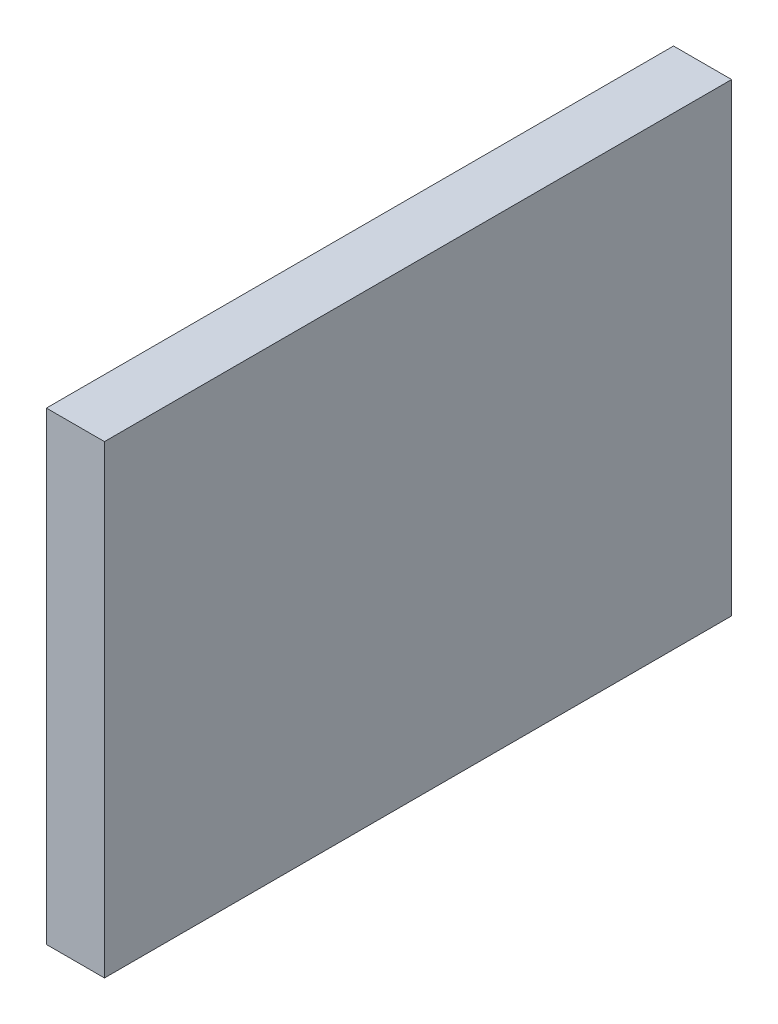
ISO-10303-21;
HEADER;
FILE_DESCRIPTION(('STEP AP214'),'2;1');
FILE_NAME('part.step','',(''),(''),'','','');
FILE_SCHEMA(('AUTOMOTIVE_DESIGN { 1 0 10303 214 1 1 1 1 }'));
ENDSEC;
DATA;
#1=APPLICATION_CONTEXT('core data for automotive mechanical design processes');
#2=APPLICATION_PROTOCOL_DEFINITION('international standard','automotive_design',2000,#1);
#3=PRODUCT_CONTEXT('',#1,'mechanical');
#4=PRODUCT('Part','Part','',(#3));
#5=PRODUCT_RELATED_PRODUCT_CATEGORY('part','',(#4));
#6=PRODUCT_DEFINITION_FORMATION('','',#4);
#7=PRODUCT_DEFINITION_CONTEXT('part definition',#1,'design');
#8=PRODUCT_DEFINITION('design','',#6,#7);
#9=PRODUCT_DEFINITION_SHAPE('','',#8);
#10=(LENGTH_UNIT() NAMED_UNIT(*) SI_UNIT(.MILLI.,.METRE.));
#11=(NAMED_UNIT(*) PLANE_ANGLE_UNIT() SI_UNIT($,.RADIAN.));
#12=(NAMED_UNIT(*) SI_UNIT($,.STERADIAN.) SOLID_ANGLE_UNIT());
#13=UNCERTAINTY_MEASURE_WITH_UNIT(LENGTH_MEASURE(1.E-05),#10,'distance_accuracy_value','');
#14=(GEOMETRIC_REPRESENTATION_CONTEXT(3) GLOBAL_UNCERTAINTY_ASSIGNED_CONTEXT((#13)) GLOBAL_UNIT_ASSIGNED_CONTEXT((#10,
#11,#12)) REPRESENTATION_CONTEXT('',''));
#15=CARTESIAN_POINT('',(0.,0.,0.));
#16=DIRECTION('',(0.,0.,1.));
#17=DIRECTION('',(1.,0.,0.));
#18=AXIS2_PLACEMENT_3D('',#15,#16,#17);
#19=CARTESIAN_POINT('',(6.35,25.4,34.29));
#20=DIRECTION('',(0.,0.,-1.));
#21=DIRECTION('',(-1.,0.,0.));
#22=AXIS2_PLACEMENT_3D('',#19,#20,#21);
#23=PLANE('',#22);
#24=DIRECTION('',(0.,-1.,0.));
#25=VECTOR('',#24,1.);
#26=CARTESIAN_POINT('',(0.,25.4,34.29));
#27=LINE('',#26,#25);
#28=CARTESIAN_POINT('',(0.,25.4,34.29));
#29=VERTEX_POINT('',#28);
#30=CARTESIAN_POINT('',(0.,-25.4,34.29));
#31=VERTEX_POINT('',#30);
#32=EDGE_CURVE('E115',#29,#31,#27,.T.);
#33=ORIENTED_EDGE('',*,*,#32,.T.);
#34=DIRECTION('',(-1.,0.,0.));
#35=VECTOR('',#34,1.);
#36=CARTESIAN_POINT('',(6.35,-25.4,34.29));
#37=LINE('',#36,#35);
#38=CARTESIAN_POINT('',(6.35,-25.4,34.29));
#39=VERTEX_POINT('',#38);
#40=EDGE_CURVE('E11',#39,#31,#37,.T.);
#41=ORIENTED_EDGE('',*,*,#40,.F.);
#42=DIRECTION('',(0.,-1.,0.));
#43=VECTOR('',#42,1.);
#44=CARTESIAN_POINT('',(6.35,25.4,34.29));
#45=LINE('',#44,#43);
#46=CARTESIAN_POINT('',(6.35,25.4,34.29));
#47=VERTEX_POINT('',#46);
#48=EDGE_CURVE('E99',#47,#39,#45,.T.);
#49=ORIENTED_EDGE('',*,*,#48,.F.);
#50=DIRECTION('',(-1.,0.,0.));
#51=VECTOR('',#50,1.);
#52=CARTESIAN_POINT('',(6.35,25.4,34.29));
#53=LINE('',#52,#51);
#54=EDGE_CURVE('E111',#47,#29,#53,.T.);
#55=ORIENTED_EDGE('',*,*,#54,.T.);
#56=EDGE_LOOP('',(#33,#41,#49,#55));
#57=FACE_BOUND('',#56,.T.);
#58=ADVANCED_FACE('F47',(#57),#23,.F.);
#59=CARTESIAN_POINT('',(6.35,-25.4,34.29));
#60=DIRECTION('',(0.,1.,0.));
#61=DIRECTION('',(0.,0.,1.));
#62=AXIS2_PLACEMENT_3D('',#59,#60,#61);
#63=PLANE('',#62);
#64=DIRECTION('',(0.,0.,-1.));
#65=VECTOR('',#64,1.);
#66=CARTESIAN_POINT('',(0.,-25.4,34.29));
#67=LINE('',#66,#65);
#68=CARTESIAN_POINT('',(0.,-25.4,-34.29));
#69=VERTEX_POINT('',#68);
#70=EDGE_CURVE('E104',#31,#69,#67,.T.);
#71=ORIENTED_EDGE('',*,*,#70,.T.);
#72=DIRECTION('',(-1.,0.,0.));
#73=VECTOR('',#72,1.);
#74=CARTESIAN_POINT('',(6.35,-25.4,-34.29));
#75=LINE('',#74,#73);
#76=CARTESIAN_POINT('',(6.35,-25.4,-34.29));
#77=VERTEX_POINT('',#76);
#78=EDGE_CURVE('E56',#77,#69,#75,.T.);
#79=ORIENTED_EDGE('',*,*,#78,.F.);
#80=DIRECTION('',(0.,0.,-1.));
#81=VECTOR('',#80,1.);
#82=CARTESIAN_POINT('',(6.35,-25.4,34.29));
#83=LINE('',#82,#81);
#84=EDGE_CURVE('E94',#39,#77,#83,.T.);
#85=ORIENTED_EDGE('',*,*,#84,.F.);
#86=ORIENTED_EDGE('',*,*,#40,.T.);
#87=EDGE_LOOP('',(#71,#79,#85,#86));
#88=FACE_BOUND('',#87,.T.);
#89=ADVANCED_FACE('F103',(#88),#63,.F.);
#90=CARTESIAN_POINT('',(6.35,25.4,-34.29));
#91=DIRECTION('',(0.,0.,1.));
#92=DIRECTION('',(1.,0.,0.));
#93=AXIS2_PLACEMENT_3D('',#90,#91,#92);
#94=PLANE('',#93);
#95=DIRECTION('',(0.,1.,0.));
#96=VECTOR('',#95,1.);
#97=CARTESIAN_POINT('',(0.,25.4,-34.29));
#98=LINE('',#97,#96);
#99=CARTESIAN_POINT('',(0.,25.4,-34.29));
#100=VERTEX_POINT('',#99);
#101=EDGE_CURVE('E81',#69,#100,#98,.T.);
#102=ORIENTED_EDGE('',*,*,#101,.T.);
#103=DIRECTION('',(-1.,0.,0.));
#104=VECTOR('',#103,1.);
#105=CARTESIAN_POINT('',(6.35,25.4,-34.29));
#106=LINE('',#105,#104);
#107=CARTESIAN_POINT('',(6.35,25.4,-34.29));
#108=VERTEX_POINT('',#107);
#109=EDGE_CURVE('E106',#108,#100,#106,.T.);
#110=ORIENTED_EDGE('',*,*,#109,.F.);
#111=DIRECTION('',(0.,1.,0.));
#112=VECTOR('',#111,1.);
#113=CARTESIAN_POINT('',(6.35,25.4,-34.29));
#114=LINE('',#113,#112);
#115=EDGE_CURVE('E97',#77,#108,#114,.T.);
#116=ORIENTED_EDGE('',*,*,#115,.F.);
#117=ORIENTED_EDGE('',*,*,#78,.T.);
#118=EDGE_LOOP('',(#102,#110,#116,#117));
#119=FACE_BOUND('',#118,.T.);
#120=ADVANCED_FACE('F107',(#119),#94,.F.);
#121=CARTESIAN_POINT('',(6.35,25.4,34.29));
#122=DIRECTION('',(0.,-1.,0.));
#123=DIRECTION('',(0.,0.,-1.));
#124=AXIS2_PLACEMENT_3D('',#121,#122,#123);
#125=PLANE('',#124);
#126=DIRECTION('',(0.,0.,1.));
#127=VECTOR('',#126,1.);
#128=CARTESIAN_POINT('',(0.,25.4,34.29));
#129=LINE('',#128,#127);
#130=EDGE_CURVE('E87',#100,#29,#129,.T.);
#131=ORIENTED_EDGE('',*,*,#130,.T.);
#132=ORIENTED_EDGE('',*,*,#54,.F.);
#133=DIRECTION('',(0.,0.,1.));
#134=VECTOR('',#133,1.);
#135=CARTESIAN_POINT('',(6.35,25.4,34.29));
#136=LINE('',#135,#134);
#137=EDGE_CURVE('E64',#108,#47,#136,.T.);
#138=ORIENTED_EDGE('',*,*,#137,.F.);
#139=ORIENTED_EDGE('',*,*,#109,.T.);
#140=EDGE_LOOP('',(#131,#132,#138,#139));
#141=FACE_BOUND('',#140,.T.);
#142=ADVANCED_FACE('F128',(#141),#125,.F.);
#143=CARTESIAN_POINT('',(6.35,0.,0.));
#144=DIRECTION('',(1.,0.,0.));
#145=DIRECTION('',(0.,0.,-1.));
#146=AXIS2_PLACEMENT_3D('',#143,#144,#145);
#147=PLANE('',#146);
#148=ORIENTED_EDGE('',*,*,#48,.T.);
#149=ORIENTED_EDGE('',*,*,#84,.T.);
#150=ORIENTED_EDGE('',*,*,#115,.T.);
#151=ORIENTED_EDGE('',*,*,#137,.T.);
#152=EDGE_LOOP('',(#148,#149,#150,#151));
#153=FACE_BOUND('',#152,.T.);
#154=ADVANCED_FACE('F95',(#153),#147,.T.);
#155=CARTESIAN_POINT('',(0.,0.,0.));
#156=DIRECTION('',(1.,0.,0.));
#157=DIRECTION('',(0.,0.,-1.));
#158=AXIS2_PLACEMENT_3D('',#155,#156,#157);
#159=PLANE('',#158);
#160=ORIENTED_EDGE('',*,*,#32,.F.);
#161=ORIENTED_EDGE('',*,*,#130,.F.);
#162=ORIENTED_EDGE('',*,*,#101,.F.);
#163=ORIENTED_EDGE('',*,*,#70,.F.);
#164=EDGE_LOOP('',(#160,#161,#162,#163));
#165=FACE_BOUND('',#164,.T.);
#166=ADVANCED_FACE('F131',(#165),#159,.F.);
#167=CLOSED_SHELL('',(#58,#89,#120,#142,#154,#166));
#168=MANIFOLD_SOLID_BREP('B2',#167);
#169=ADVANCED_BREP_SHAPE_REPRESENTATION('',(#18,#168),#14);
#170=SHAPE_DEFINITION_REPRESENTATION(#9,#169);
ENDSEC;
END-ISO-10303-21;
